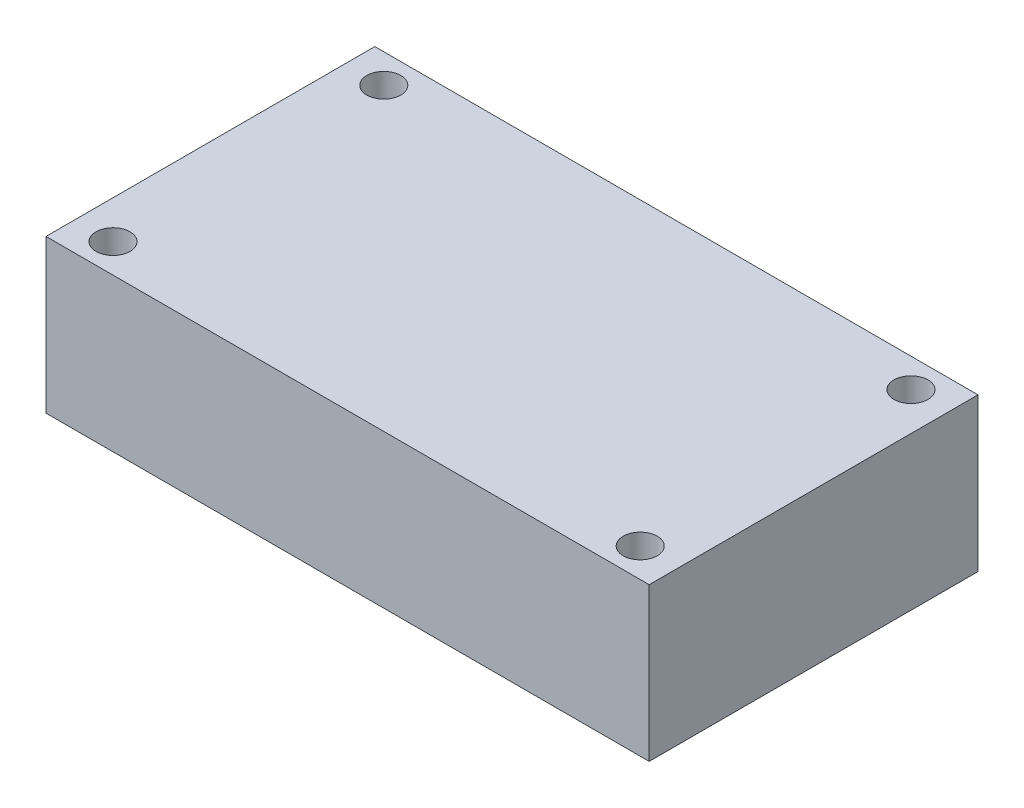
ISO-10303-21;
HEADER;
FILE_DESCRIPTION(('STEP AP214'),'2;1');
FILE_NAME('part.step','',(''),(''),'','','');
FILE_SCHEMA(('AUTOMOTIVE_DESIGN { 1 0 10303 214 1 1 1 1 }'));
ENDSEC;
DATA;
#1=APPLICATION_CONTEXT('core data for automotive mechanical design processes');
#2=APPLICATION_PROTOCOL_DEFINITION('international standard','automotive_design',2000,#1);
#3=PRODUCT_CONTEXT('',#1,'mechanical');
#4=PRODUCT('Part','Part','',(#3));
#5=PRODUCT_RELATED_PRODUCT_CATEGORY('part','',(#4));
#6=PRODUCT_DEFINITION_FORMATION('','',#4);
#7=PRODUCT_DEFINITION_CONTEXT('part definition',#1,'design');
#8=PRODUCT_DEFINITION('design','',#6,#7);
#9=PRODUCT_DEFINITION_SHAPE('','',#8);
#10=(LENGTH_UNIT() NAMED_UNIT(*) SI_UNIT(.MILLI.,.METRE.));
#11=(NAMED_UNIT(*) PLANE_ANGLE_UNIT() SI_UNIT($,.RADIAN.));
#12=(NAMED_UNIT(*) SI_UNIT($,.STERADIAN.) SOLID_ANGLE_UNIT());
#13=UNCERTAINTY_MEASURE_WITH_UNIT(LENGTH_MEASURE(1.E-05),#10,'distance_accuracy_value','');
#14=(GEOMETRIC_REPRESENTATION_CONTEXT(3) GLOBAL_UNCERTAINTY_ASSIGNED_CONTEXT((#13)) GLOBAL_UNIT_ASSIGNED_CONTEXT((#10,
#11,#12)) REPRESENTATION_CONTEXT('',''));
#15=CARTESIAN_POINT('',(0.,0.,0.));
#16=DIRECTION('',(0.,0.,1.));
#17=DIRECTION('',(1.,0.,0.));
#18=AXIS2_PLACEMENT_3D('',#15,#16,#17);
#19=CARTESIAN_POINT('',(-26.6,13.5,14.5));
#20=DIRECTION('',(1.,0.,0.));
#21=DIRECTION('',(0.,0.,-1.));
#22=AXIS2_PLACEMENT_3D('',#19,#20,#21);
#23=PLANE('',#22);
#24=DIRECTION('',(0.,0.,1.));
#25=VECTOR('',#24,1.);
#26=CARTESIAN_POINT('',(-26.6,0.,14.5));
#27=LINE('',#26,#25);
#28=CARTESIAN_POINT('',(-26.6,0.,-14.5));
#29=VERTEX_POINT('',#28);
#30=CARTESIAN_POINT('',(-26.6,0.,14.5));
#31=VERTEX_POINT('',#30);
#32=EDGE_CURVE('E103',#29,#31,#27,.T.);
#33=ORIENTED_EDGE('',*,*,#32,.T.);
#34=DIRECTION('',(0.,-1.,0.));
#35=VECTOR('',#34,1.);
#36=CARTESIAN_POINT('',(-26.6,13.5,14.5));
#37=LINE('',#36,#35);
#38=CARTESIAN_POINT('',(-26.6,13.5,14.5));
#39=VERTEX_POINT('',#38);
#40=EDGE_CURVE('E11',#39,#31,#37,.T.);
#41=ORIENTED_EDGE('',*,*,#40,.F.);
#42=DIRECTION('',(0.,0.,1.));
#43=VECTOR('',#42,1.);
#44=CARTESIAN_POINT('',(-26.6,13.5,14.5));
#45=LINE('',#44,#43);
#46=CARTESIAN_POINT('',(-26.6,13.5,-14.5));
#47=VERTEX_POINT('',#46);
#48=EDGE_CURVE('E91',#47,#39,#45,.T.);
#49=ORIENTED_EDGE('',*,*,#48,.F.);
#50=DIRECTION('',(0.,-1.,0.));
#51=VECTOR('',#50,1.);
#52=CARTESIAN_POINT('',(-26.6,13.5,-14.5));
#53=LINE('',#52,#51);
#54=EDGE_CURVE('E99',#47,#29,#53,.T.);
#55=ORIENTED_EDGE('',*,*,#54,.T.);
#56=EDGE_LOOP('',(#33,#41,#49,#55));
#57=FACE_BOUND('',#56,.T.);
#58=ADVANCED_FACE('F40',(#57),#23,.F.);
#59=CARTESIAN_POINT('',(26.6,13.5,14.5));
#60=DIRECTION('',(0.,0.,-1.));
#61=DIRECTION('',(-1.,0.,0.));
#62=AXIS2_PLACEMENT_3D('',#59,#60,#61);
#63=PLANE('',#62);
#64=DIRECTION('',(1.,0.,0.));
#65=VECTOR('',#64,1.);
#66=CARTESIAN_POINT('',(26.6,0.,14.5));
#67=LINE('',#66,#65);
#68=CARTESIAN_POINT('',(26.6,0.,14.5));
#69=VERTEX_POINT('',#68);
#70=EDGE_CURVE('E95',#31,#69,#67,.T.);
#71=ORIENTED_EDGE('',*,*,#70,.T.);
#72=DIRECTION('',(0.,-1.,0.));
#73=VECTOR('',#72,1.);
#74=CARTESIAN_POINT('',(26.6,13.5,14.5));
#75=LINE('',#74,#73);
#76=CARTESIAN_POINT('',(26.6,13.5,14.5));
#77=VERTEX_POINT('',#76);
#78=EDGE_CURVE('E48',#77,#69,#75,.T.);
#79=ORIENTED_EDGE('',*,*,#78,.F.);
#80=DIRECTION('',(1.,0.,0.));
#81=VECTOR('',#80,1.);
#82=CARTESIAN_POINT('',(26.6,13.5,14.5));
#83=LINE('',#82,#81);
#84=EDGE_CURVE('E86',#39,#77,#83,.T.);
#85=ORIENTED_EDGE('',*,*,#84,.F.);
#86=ORIENTED_EDGE('',*,*,#40,.T.);
#87=EDGE_LOOP('',(#71,#79,#85,#86));
#88=FACE_BOUND('',#87,.T.);
#89=ADVANCED_FACE('F94',(#88),#63,.F.);
#90=CARTESIAN_POINT('',(26.6,13.5,14.5));
#91=DIRECTION('',(-1.,0.,0.));
#92=DIRECTION('',(0.,0.,1.));
#93=AXIS2_PLACEMENT_3D('',#90,#91,#92);
#94=PLANE('',#93);
#95=DIRECTION('',(0.,0.,-1.));
#96=VECTOR('',#95,1.);
#97=CARTESIAN_POINT('',(26.6,0.,14.5));
#98=LINE('',#97,#96);
#99=CARTESIAN_POINT('',(26.6,0.,-14.5));
#100=VERTEX_POINT('',#99);
#101=EDGE_CURVE('E73',#69,#100,#98,.T.);
#102=ORIENTED_EDGE('',*,*,#101,.T.);
#103=DIRECTION('',(0.,-1.,0.));
#104=VECTOR('',#103,1.);
#105=CARTESIAN_POINT('',(26.6,13.5,-14.5));
#106=LINE('',#105,#104);
#107=CARTESIAN_POINT('',(26.6,13.5,-14.5));
#108=VERTEX_POINT('',#107);
#109=EDGE_CURVE('E96',#108,#100,#106,.T.);
#110=ORIENTED_EDGE('',*,*,#109,.F.);
#111=DIRECTION('',(0.,0.,-1.));
#112=VECTOR('',#111,1.);
#113=CARTESIAN_POINT('',(26.6,13.5,14.5));
#114=LINE('',#113,#112);
#115=EDGE_CURVE('E89',#77,#108,#114,.T.);
#116=ORIENTED_EDGE('',*,*,#115,.F.);
#117=ORIENTED_EDGE('',*,*,#78,.T.);
#118=EDGE_LOOP('',(#102,#110,#116,#117));
#119=FACE_BOUND('',#118,.T.);
#120=ADVANCED_FACE('F97',(#119),#94,.F.);
#121=CARTESIAN_POINT('',(26.6,13.5,-14.5));
#122=DIRECTION('',(0.,0.,1.));
#123=DIRECTION('',(1.,0.,0.));
#124=AXIS2_PLACEMENT_3D('',#121,#122,#123);
#125=PLANE('',#124);
#126=DIRECTION('',(-1.,0.,0.));
#127=VECTOR('',#126,1.);
#128=CARTESIAN_POINT('',(26.6,0.,-14.5));
#129=LINE('',#128,#127);
#130=EDGE_CURVE('E79',#100,#29,#129,.T.);
#131=ORIENTED_EDGE('',*,*,#130,.T.);
#132=ORIENTED_EDGE('',*,*,#54,.F.);
#133=DIRECTION('',(-1.,0.,0.));
#134=VECTOR('',#133,1.);
#135=CARTESIAN_POINT('',(26.6,13.5,-14.5));
#136=LINE('',#135,#134);
#137=EDGE_CURVE('E56',#108,#47,#136,.T.);
#138=ORIENTED_EDGE('',*,*,#137,.F.);
#139=ORIENTED_EDGE('',*,*,#109,.T.);
#140=EDGE_LOOP('',(#131,#132,#138,#139));
#141=FACE_BOUND('',#140,.T.);
#142=ADVANCED_FACE('F111',(#141),#125,.F.);
#143=CARTESIAN_POINT('',(0.,13.5,0.));
#144=DIRECTION('',(0.,1.,0.));
#145=DIRECTION('',(0.,0.,1.));
#146=AXIS2_PLACEMENT_3D('',#143,#144,#145);
#147=PLANE('',#146);
#148=CARTESIAN_POINT('',(-23.25,13.5,11.94));
#149=DIRECTION('',(0.,1.,0.));
#150=DIRECTION('',(0.,0.,1.));
#151=AXIS2_PLACEMENT_3D('',#148,#149,#150);
#152=CIRCLE('',#151,1.5);
#153=CARTESIAN_POINT('',(-23.25,13.5,13.44));
#154=VERTEX_POINT('',#153);
#155=EDGE_CURVE('E106',#154,#154,#152,.T.);
#156=ORIENTED_EDGE('',*,*,#155,.F.);
#157=EDGE_LOOP('',(#156));
#158=FACE_BOUND('',#157,.T.);
#159=CARTESIAN_POINT('',(23.25,13.5,-11.94));
#160=DIRECTION('',(0.,1.,0.));
#161=DIRECTION('',(0.,0.,1.));
#162=AXIS2_PLACEMENT_3D('',#159,#160,#161);
#163=CIRCLE('',#162,1.5);
#164=CARTESIAN_POINT('',(23.25,13.5,-10.44));
#165=VERTEX_POINT('',#164);
#166=EDGE_CURVE('E119',#165,#165,#163,.T.);
#167=ORIENTED_EDGE('',*,*,#166,.F.);
#168=EDGE_LOOP('',(#167));
#169=FACE_BOUND('',#168,.T.);
#170=CARTESIAN_POINT('',(-23.25,13.5,-11.94));
#171=DIRECTION('',(0.,1.,0.));
#172=DIRECTION('',(0.,0.,1.));
#173=AXIS2_PLACEMENT_3D('',#170,#171,#172);
#174=CIRCLE('',#173,1.5);
#175=CARTESIAN_POINT('',(-23.25,13.5,-10.44));
#176=VERTEX_POINT('',#175);
#177=EDGE_CURVE('E122',#176,#176,#174,.T.);
#178=ORIENTED_EDGE('',*,*,#177,.F.);
#179=EDGE_LOOP('',(#178));
#180=FACE_BOUND('',#179,.T.);
#181=CARTESIAN_POINT('',(23.25,13.5,11.94));
#182=DIRECTION('',(0.,1.,0.));
#183=DIRECTION('',(0.,0.,1.));
#184=AXIS2_PLACEMENT_3D('',#181,#182,#183);
#185=CIRCLE('',#184,1.5);
#186=CARTESIAN_POINT('',(23.25,13.5,13.44));
#187=VERTEX_POINT('',#186);
#188=EDGE_CURVE('E125',#187,#187,#185,.T.);
#189=ORIENTED_EDGE('',*,*,#188,.F.);
#190=EDGE_LOOP('',(#189));
#191=FACE_BOUND('',#190,.T.);
#192=ORIENTED_EDGE('',*,*,#48,.T.);
#193=ORIENTED_EDGE('',*,*,#84,.T.);
#194=ORIENTED_EDGE('',*,*,#115,.T.);
#195=ORIENTED_EDGE('',*,*,#137,.T.);
#196=EDGE_LOOP('',(#192,#193,#194,#195));
#197=FACE_BOUND('',#196,.T.);
#198=ADVANCED_FACE('F87',(#158,#169,#180,#191,#197),#147,.T.);
#199=CARTESIAN_POINT('',(0.,0.,0.));
#200=DIRECTION('',(0.,1.,0.));
#201=DIRECTION('',(0.,0.,1.));
#202=AXIS2_PLACEMENT_3D('',#199,#200,#201);
#203=PLANE('',#202);
#204=CARTESIAN_POINT('',(-23.25,0.,11.94));
#205=DIRECTION('',(0.,-1.,0.));
#206=DIRECTION('',(0.,0.,-1.));
#207=AXIS2_PLACEMENT_3D('',#204,#205,#206);
#208=CIRCLE('',#207,1.5);
#209=CARTESIAN_POINT('',(-23.25,0.,10.44));
#210=VERTEX_POINT('',#209);
#211=EDGE_CURVE('E131',#210,#210,#208,.T.);
#212=ORIENTED_EDGE('',*,*,#211,.F.);
#213=EDGE_LOOP('',(#212));
#214=FACE_BOUND('',#213,.T.);
#215=CARTESIAN_POINT('',(23.25,0.,-11.94));
#216=DIRECTION('',(0.,-1.,0.));
#217=DIRECTION('',(0.,0.,-1.));
#218=AXIS2_PLACEMENT_3D('',#215,#216,#217);
#219=CIRCLE('',#218,1.5);
#220=CARTESIAN_POINT('',(23.25,0.,-13.44));
#221=VERTEX_POINT('',#220);
#222=EDGE_CURVE('E132',#221,#221,#219,.T.);
#223=ORIENTED_EDGE('',*,*,#222,.F.);
#224=EDGE_LOOP('',(#223));
#225=FACE_BOUND('',#224,.T.);
#226=CARTESIAN_POINT('',(-23.25,0.,-11.94));
#227=DIRECTION('',(0.,-1.,0.));
#228=DIRECTION('',(0.,0.,-1.));
#229=AXIS2_PLACEMENT_3D('',#226,#227,#228);
#230=CIRCLE('',#229,1.5);
#231=CARTESIAN_POINT('',(-23.25,0.,-13.44));
#232=VERTEX_POINT('',#231);
#233=EDGE_CURVE('E135',#232,#232,#230,.T.);
#234=ORIENTED_EDGE('',*,*,#233,.F.);
#235=EDGE_LOOP('',(#234));
#236=FACE_BOUND('',#235,.T.);
#237=CARTESIAN_POINT('',(23.25,0.,11.94));
#238=DIRECTION('',(0.,-1.,0.));
#239=DIRECTION('',(0.,0.,-1.));
#240=AXIS2_PLACEMENT_3D('',#237,#238,#239);
#241=CIRCLE('',#240,1.5);
#242=CARTESIAN_POINT('',(23.25,0.,10.44));
#243=VERTEX_POINT('',#242);
#244=EDGE_CURVE('E128',#243,#243,#241,.T.);
#245=ORIENTED_EDGE('',*,*,#244,.F.);
#246=EDGE_LOOP('',(#245));
#247=FACE_BOUND('',#246,.T.);
#248=ORIENTED_EDGE('',*,*,#32,.F.);
#249=ORIENTED_EDGE('',*,*,#130,.F.);
#250=ORIENTED_EDGE('',*,*,#101,.F.);
#251=ORIENTED_EDGE('',*,*,#70,.F.);
#252=EDGE_LOOP('',(#248,#249,#250,#251));
#253=FACE_BOUND('',#252,.T.);
#254=ADVANCED_FACE('F114',(#214,#225,#236,#247,#253),#203,.F.);
#255=CARTESIAN_POINT('',(23.25,50.,11.94));
#256=DIRECTION('',(0.,-1.,0.));
#257=DIRECTION('',(0.,0.,-1.));
#258=AXIS2_PLACEMENT_3D('',#255,#256,#257);
#259=CYLINDRICAL_SURFACE('',#258,1.5);
#260=ORIENTED_EDGE('',*,*,#188,.T.);
#261=EDGE_LOOP('',(#260));
#262=FACE_BOUND('',#261,.T.);
#263=ORIENTED_EDGE('',*,*,#244,.T.);
#264=EDGE_LOOP('',(#263));
#265=FACE_BOUND('',#264,.T.);
#266=ADVANCED_FACE('F145',(#262,#265),#259,.F.);
#267=CARTESIAN_POINT('',(-23.25,50.,-11.94));
#268=DIRECTION('',(0.,-1.,0.));
#269=DIRECTION('',(0.,0.,-1.));
#270=AXIS2_PLACEMENT_3D('',#267,#268,#269);
#271=CYLINDRICAL_SURFACE('',#270,1.5);
#272=ORIENTED_EDGE('',*,*,#177,.T.);
#273=EDGE_LOOP('',(#272));
#274=FACE_BOUND('',#273,.T.);
#275=ORIENTED_EDGE('',*,*,#233,.T.);
#276=EDGE_LOOP('',(#275));
#277=FACE_BOUND('',#276,.T.);
#278=ADVANCED_FACE('F141',(#274,#277),#271,.F.);
#279=CARTESIAN_POINT('',(23.25,50.,-11.94));
#280=DIRECTION('',(0.,-1.,0.));
#281=DIRECTION('',(0.,0.,-1.));
#282=AXIS2_PLACEMENT_3D('',#279,#280,#281);
#283=CYLINDRICAL_SURFACE('',#282,1.5);
#284=ORIENTED_EDGE('',*,*,#166,.T.);
#285=EDGE_LOOP('',(#284));
#286=FACE_BOUND('',#285,.T.);
#287=ORIENTED_EDGE('',*,*,#222,.T.);
#288=EDGE_LOOP('',(#287));
#289=FACE_BOUND('',#288,.T.);
#290=ADVANCED_FACE('F156',(#286,#289),#283,.F.);
#291=CARTESIAN_POINT('',(-23.25,50.,11.94));
#292=DIRECTION('',(0.,-1.,0.));
#293=DIRECTION('',(0.,0.,-1.));
#294=AXIS2_PLACEMENT_3D('',#291,#292,#293);
#295=CYLINDRICAL_SURFACE('',#294,1.5);
#296=ORIENTED_EDGE('',*,*,#155,.T.);
#297=EDGE_LOOP('',(#296));
#298=FACE_BOUND('',#297,.T.);
#299=ORIENTED_EDGE('',*,*,#211,.T.);
#300=EDGE_LOOP('',(#299));
#301=FACE_BOUND('',#300,.T.);
#302=ADVANCED_FACE('F185',(#298,#301),#295,.F.);
#303=CLOSED_SHELL('',(#58,#89,#120,#142,#198,#254,#266,#278,#290,#302));
#304=MANIFOLD_SOLID_BREP('B2',#303);
#305=ADVANCED_BREP_SHAPE_REPRESENTATION('',(#18,#304),#14);
#306=SHAPE_DEFINITION_REPRESENTATION(#9,#305);
ENDSEC;
END-ISO-10303-21;
